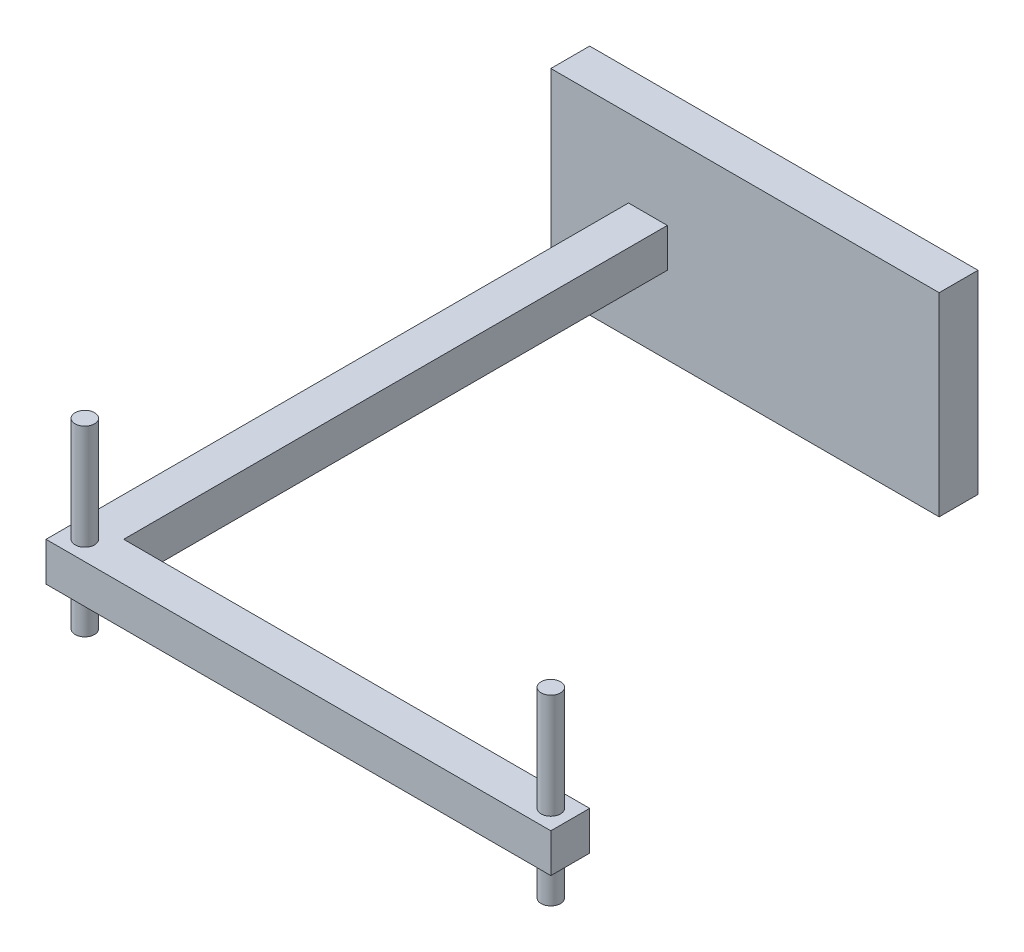
ISO-10303-21;
HEADER;
FILE_DESCRIPTION(('STEP AP214'),'2;1');
FILE_NAME('part.step','',(''),(''),'','','');
FILE_SCHEMA(('AUTOMOTIVE_DESIGN { 1 0 10303 214 1 1 1 1 }'));
ENDSEC;
DATA;
#1=APPLICATION_CONTEXT('core data for automotive mechanical design processes');
#2=APPLICATION_PROTOCOL_DEFINITION('international standard','automotive_design',2000,#1);
#3=PRODUCT_CONTEXT('',#1,'mechanical');
#4=PRODUCT('Part','Part','',(#3));
#5=PRODUCT_RELATED_PRODUCT_CATEGORY('part','',(#4));
#6=PRODUCT_DEFINITION_FORMATION('','',#4);
#7=PRODUCT_DEFINITION_CONTEXT('part definition',#1,'design');
#8=PRODUCT_DEFINITION('design','',#6,#7);
#9=PRODUCT_DEFINITION_SHAPE('','',#8);
#10=(LENGTH_UNIT() NAMED_UNIT(*) SI_UNIT(.MILLI.,.METRE.));
#11=(NAMED_UNIT(*) PLANE_ANGLE_UNIT() SI_UNIT($,.RADIAN.));
#12=(NAMED_UNIT(*) SI_UNIT($,.STERADIAN.) SOLID_ANGLE_UNIT());
#13=UNCERTAINTY_MEASURE_WITH_UNIT(LENGTH_MEASURE(1.E-05),#10,'distance_accuracy_value','');
#14=(GEOMETRIC_REPRESENTATION_CONTEXT(3) GLOBAL_UNCERTAINTY_ASSIGNED_CONTEXT((#13)) GLOBAL_UNIT_ASSIGNED_CONTEXT((#10,
#11,#12)) REPRESENTATION_CONTEXT('',''));
#15=CARTESIAN_POINT('',(0.,0.,0.));
#16=DIRECTION('',(0.,0.,1.));
#17=DIRECTION('',(1.,0.,0.));
#18=AXIS2_PLACEMENT_3D('',#15,#16,#17);
#19=CARTESIAN_POINT('',(-20.,5.,160.));
#20=DIRECTION('',(-1.,0.,0.));
#21=DIRECTION('',(0.,-1.,0.));
#22=AXIS2_PLACEMENT_3D('',#19,#20,#21);
#23=PLANE('',#22);
#24=DIRECTION('',(0.,1.,0.));
#25=VECTOR('',#24,1.);
#26=CARTESIAN_POINT('',(-20.,5.,150.));
#27=LINE('',#26,#25);
#28=CARTESIAN_POINT('',(-20.,-5.,150.));
#29=VERTEX_POINT('',#28);
#30=CARTESIAN_POINT('',(-20.,5.,150.));
#31=VERTEX_POINT('',#30);
#32=EDGE_CURVE('E146',#29,#31,#27,.T.);
#33=ORIENTED_EDGE('',*,*,#32,.F.);
#34=DIRECTION('',(0.,0.,-1.));
#35=VECTOR('',#34,1.);
#36=CARTESIAN_POINT('',(-20.,-5.,160.));
#37=LINE('',#36,#35);
#38=CARTESIAN_POINT('',(-20.,-5.,10.));
#39=VERTEX_POINT('',#38);
#40=EDGE_CURVE('E173',#29,#39,#37,.T.);
#41=ORIENTED_EDGE('',*,*,#40,.T.);
#42=DIRECTION('',(0.,1.,0.));
#43=VECTOR('',#42,1.);
#44=CARTESIAN_POINT('',(-20.,5.,10.));
#45=LINE('',#44,#43);
#46=CARTESIAN_POINT('',(-20.,5.,10.));
#47=VERTEX_POINT('',#46);
#48=EDGE_CURVE('E167',#39,#47,#45,.T.);
#49=ORIENTED_EDGE('',*,*,#48,.T.);
#50=DIRECTION('',(0.,0.,-1.));
#51=VECTOR('',#50,1.);
#52=CARTESIAN_POINT('',(-20.,5.,160.));
#53=LINE('',#52,#51);
#54=EDGE_CURVE('E48',#31,#47,#53,.T.);
#55=ORIENTED_EDGE('',*,*,#54,.F.);
#56=EDGE_LOOP('',(#33,#41,#49,#55));
#57=FACE_BOUND('',#56,.T.);
#58=ADVANCED_FACE('F33',(#57),#23,.F.);
#59=CARTESIAN_POINT('',(0.,0.,10.));
#60=DIRECTION('',(0.,0.,1.));
#61=DIRECTION('',(1.,0.,0.));
#62=AXIS2_PLACEMENT_3D('',#59,#60,#61);
#63=PLANE('',#62);
#64=DIRECTION('',(0.,1.,0.));
#65=VECTOR('',#64,1.);
#66=CARTESIAN_POINT('',(50.,25.,10.));
#67=LINE('',#66,#65);
#68=CARTESIAN_POINT('',(50.,-25.,10.));
#69=VERTEX_POINT('',#68);
#70=CARTESIAN_POINT('',(50.,25.,10.));
#71=VERTEX_POINT('',#70);
#72=EDGE_CURVE('E178',#69,#71,#67,.T.);
#73=ORIENTED_EDGE('',*,*,#72,.T.);
#74=DIRECTION('',(-1.,0.,0.));
#75=VECTOR('',#74,1.);
#76=CARTESIAN_POINT('',(-50.,25.,10.));
#77=LINE('',#76,#75);
#78=CARTESIAN_POINT('',(-50.,25.,10.));
#79=VERTEX_POINT('',#78);
#80=EDGE_CURVE('E86',#71,#79,#77,.T.);
#81=ORIENTED_EDGE('',*,*,#80,.T.);
#82=DIRECTION('',(0.,-1.,0.));
#83=VECTOR('',#82,1.);
#84=CARTESIAN_POINT('',(-50.,25.,10.));
#85=LINE('',#84,#83);
#86=CARTESIAN_POINT('',(-50.,-25.,10.));
#87=VERTEX_POINT('',#86);
#88=EDGE_CURVE('E181',#79,#87,#85,.T.);
#89=ORIENTED_EDGE('',*,*,#88,.T.);
#90=DIRECTION('',(1.,0.,0.));
#91=VECTOR('',#90,1.);
#92=CARTESIAN_POINT('',(-50.,-25.,10.));
#93=LINE('',#92,#91);
#94=EDGE_CURVE('E57',#87,#69,#93,.T.);
#95=ORIENTED_EDGE('',*,*,#94,.T.);
#96=EDGE_LOOP('',(#73,#81,#89,#95));
#97=FACE_BOUND('',#96,.T.);
#98=DIRECTION('',(1.,0.,0.));
#99=VECTOR('',#98,1.);
#100=CARTESIAN_POINT('',(-20.,-5.,10.));
#101=LINE('',#100,#99);
#102=CARTESIAN_POINT('',(-30.,-5.,10.));
#103=VERTEX_POINT('',#102);
#104=EDGE_CURVE('E165',#103,#39,#101,.T.);
#105=ORIENTED_EDGE('',*,*,#104,.F.);
#106=DIRECTION('',(0.,-1.,0.));
#107=VECTOR('',#106,1.);
#108=CARTESIAN_POINT('',(-30.,5.,10.));
#109=LINE('',#108,#107);
#110=CARTESIAN_POINT('',(-30.,5.,10.));
#111=VERTEX_POINT('',#110);
#112=EDGE_CURVE('E158',#111,#103,#109,.T.);
#113=ORIENTED_EDGE('',*,*,#112,.F.);
#114=DIRECTION('',(-1.,0.,0.));
#115=VECTOR('',#114,1.);
#116=CARTESIAN_POINT('',(-20.,5.,10.));
#117=LINE('',#116,#115);
#118=EDGE_CURVE('E159',#47,#111,#117,.T.);
#119=ORIENTED_EDGE('',*,*,#118,.F.);
#120=ORIENTED_EDGE('',*,*,#48,.F.);
#121=EDGE_LOOP('',(#105,#113,#119,#120));
#122=FACE_BOUND('',#121,.T.);
#123=ADVANCED_FACE('F221',(#97,#122),#63,.T.);
#124=CARTESIAN_POINT('',(50.,25.,10.));
#125=DIRECTION('',(-1.,0.,0.));
#126=DIRECTION('',(0.,-1.,0.));
#127=AXIS2_PLACEMENT_3D('',#124,#125,#126);
#128=PLANE('',#127);
#129=DIRECTION('',(0.,1.,0.));
#130=VECTOR('',#129,1.);
#131=CARTESIAN_POINT('',(50.,25.,0.));
#132=LINE('',#131,#130);
#133=CARTESIAN_POINT('',(50.,-25.,0.));
#134=VERTEX_POINT('',#133);
#135=CARTESIAN_POINT('',(50.,25.,0.));
#136=VERTEX_POINT('',#135);
#137=EDGE_CURVE('E177',#134,#136,#132,.T.);
#138=ORIENTED_EDGE('',*,*,#137,.T.);
#139=DIRECTION('',(0.,0.,-1.));
#140=VECTOR('',#139,1.);
#141=CARTESIAN_POINT('',(50.,25.,10.));
#142=LINE('',#141,#140);
#143=EDGE_CURVE('E198',#71,#136,#142,.T.);
#144=ORIENTED_EDGE('',*,*,#143,.F.);
#145=ORIENTED_EDGE('',*,*,#72,.F.);
#146=DIRECTION('',(0.,0.,-1.));
#147=VECTOR('',#146,1.);
#148=CARTESIAN_POINT('',(50.,-25.,10.));
#149=LINE('',#148,#147);
#150=EDGE_CURVE('E184',#69,#134,#149,.T.);
#151=ORIENTED_EDGE('',*,*,#150,.T.);
#152=EDGE_LOOP('',(#138,#144,#145,#151));
#153=FACE_BOUND('',#152,.T.);
#154=ADVANCED_FACE('F35',(#153),#128,.F.);
#155=CARTESIAN_POINT('',(-50.,25.,10.));
#156=DIRECTION('',(0.,-1.,0.));
#157=DIRECTION('',(0.,0.,-1.));
#158=AXIS2_PLACEMENT_3D('',#155,#156,#157);
#159=PLANE('',#158);
#160=DIRECTION('',(-1.,0.,0.));
#161=VECTOR('',#160,1.);
#162=CARTESIAN_POINT('',(-50.,25.,0.));
#163=LINE('',#162,#161);
#164=CARTESIAN_POINT('',(-50.,25.,0.));
#165=VERTEX_POINT('',#164);
#166=EDGE_CURVE('E187',#136,#165,#163,.T.);
#167=ORIENTED_EDGE('',*,*,#166,.T.);
#168=DIRECTION('',(0.,0.,-1.));
#169=VECTOR('',#168,1.);
#170=CARTESIAN_POINT('',(-50.,25.,10.));
#171=LINE('',#170,#169);
#172=EDGE_CURVE('E195',#79,#165,#171,.T.);
#173=ORIENTED_EDGE('',*,*,#172,.F.);
#174=ORIENTED_EDGE('',*,*,#80,.F.);
#175=ORIENTED_EDGE('',*,*,#143,.T.);
#176=EDGE_LOOP('',(#167,#173,#174,#175));
#177=FACE_BOUND('',#176,.T.);
#178=ADVANCED_FACE('F422',(#177),#159,.F.);
#179=CARTESIAN_POINT('',(-50.,25.,10.));
#180=DIRECTION('',(1.,0.,0.));
#181=DIRECTION('',(0.,1.,0.));
#182=AXIS2_PLACEMENT_3D('',#179,#180,#181);
#183=PLANE('',#182);
#184=DIRECTION('',(0.,-1.,0.));
#185=VECTOR('',#184,1.);
#186=CARTESIAN_POINT('',(-50.,25.,0.));
#187=LINE('',#186,#185);
#188=CARTESIAN_POINT('',(-50.,-25.,0.));
#189=VERTEX_POINT('',#188);
#190=EDGE_CURVE('E189',#165,#189,#187,.T.);
#191=ORIENTED_EDGE('',*,*,#190,.T.);
#192=DIRECTION('',(0.,0.,-1.));
#193=VECTOR('',#192,1.);
#194=CARTESIAN_POINT('',(-50.,-25.,10.));
#195=LINE('',#194,#193);
#196=EDGE_CURVE('E193',#87,#189,#195,.T.);
#197=ORIENTED_EDGE('',*,*,#196,.F.);
#198=ORIENTED_EDGE('',*,*,#88,.F.);
#199=ORIENTED_EDGE('',*,*,#172,.T.);
#200=EDGE_LOOP('',(#191,#197,#198,#199));
#201=FACE_BOUND('',#200,.T.);
#202=ADVANCED_FACE('F413',(#201),#183,.F.);
#203=CARTESIAN_POINT('',(-50.,-25.,10.));
#204=DIRECTION('',(0.,1.,0.));
#205=DIRECTION('',(0.,0.,1.));
#206=AXIS2_PLACEMENT_3D('',#203,#204,#205);
#207=PLANE('',#206);
#208=DIRECTION('',(1.,0.,0.));
#209=VECTOR('',#208,1.);
#210=CARTESIAN_POINT('',(-50.,-25.,0.));
#211=LINE('',#210,#209);
#212=EDGE_CURVE('E78',#189,#134,#211,.T.);
#213=ORIENTED_EDGE('',*,*,#212,.T.);
#214=ORIENTED_EDGE('',*,*,#150,.F.);
#215=ORIENTED_EDGE('',*,*,#94,.F.);
#216=ORIENTED_EDGE('',*,*,#196,.T.);
#217=EDGE_LOOP('',(#213,#214,#215,#216));
#218=FACE_BOUND('',#217,.T.);
#219=ADVANCED_FACE('F403',(#218),#207,.F.);
#220=CARTESIAN_POINT('',(0.,0.,0.));
#221=DIRECTION('',(0.,0.,1.));
#222=DIRECTION('',(1.,0.,0.));
#223=AXIS2_PLACEMENT_3D('',#220,#221,#222);
#224=PLANE('',#223);
#225=ORIENTED_EDGE('',*,*,#137,.F.);
#226=ORIENTED_EDGE('',*,*,#212,.F.);
#227=ORIENTED_EDGE('',*,*,#190,.F.);
#228=ORIENTED_EDGE('',*,*,#166,.F.);
#229=EDGE_LOOP('',(#225,#226,#227,#228));
#230=FACE_BOUND('',#229,.T.);
#231=ADVANCED_FACE('F215',(#230),#224,.F.);
#232=CARTESIAN_POINT('',(-30.,5.,160.));
#233=DIRECTION('',(1.,0.,0.));
#234=DIRECTION('',(0.,0.,-1.));
#235=AXIS2_PLACEMENT_3D('',#232,#233,#234);
#236=PLANE('',#235);
#237=ORIENTED_EDGE('',*,*,#112,.T.);
#238=DIRECTION('',(0.,0.,-1.));
#239=VECTOR('',#238,1.);
#240=CARTESIAN_POINT('',(-30.,-5.,160.));
#241=LINE('',#240,#239);
#242=CARTESIAN_POINT('',(-30.,-5.,160.));
#243=VERTEX_POINT('',#242);
#244=EDGE_CURVE('E175',#243,#103,#241,.T.);
#245=ORIENTED_EDGE('',*,*,#244,.F.);
#246=DIRECTION('',(0.,-1.,0.));
#247=VECTOR('',#246,1.);
#248=CARTESIAN_POINT('',(-30.,5.,160.));
#249=LINE('',#248,#247);
#250=CARTESIAN_POINT('',(-30.,5.,160.));
#251=VERTEX_POINT('',#250);
#252=EDGE_CURVE('E127',#251,#243,#249,.T.);
#253=ORIENTED_EDGE('',*,*,#252,.F.);
#254=DIRECTION('',(0.,0.,-1.));
#255=VECTOR('',#254,1.);
#256=CARTESIAN_POINT('',(-30.,5.,160.));
#257=LINE('',#256,#255);
#258=EDGE_CURVE('E162',#251,#111,#257,.T.);
#259=ORIENTED_EDGE('',*,*,#258,.T.);
#260=EDGE_LOOP('',(#237,#245,#253,#259));
#261=FACE_BOUND('',#260,.T.);
#262=ADVANCED_FACE('F206',(#261),#236,.F.);
#263=CARTESIAN_POINT('',(-20.,-5.,160.));
#264=DIRECTION('',(0.,1.,0.));
#265=DIRECTION('',(-1.,0.,0.));
#266=AXIS2_PLACEMENT_3D('',#263,#264,#265);
#267=PLANE('',#266);
#268=CARTESIAN_POINT('',(95.,-4.99999999999999,155.));
#269=DIRECTION('',(0.,1.,0.));
#270=DIRECTION('',(-1.,0.,0.));
#271=AXIS2_PLACEMENT_3D('',#268,#269,#270);
#272=CIRCLE('',#271,2.50000000000001);
#273=CARTESIAN_POINT('',(92.5,-4.99999999999999,155.));
#274=VERTEX_POINT('',#273);
#275=EDGE_CURVE('E11',#274,#274,#272,.F.);
#276=ORIENTED_EDGE('',*,*,#275,.F.);
#277=EDGE_LOOP('',(#276));
#278=FACE_BOUND('',#277,.T.);
#279=CARTESIAN_POINT('',(-25.,-5.,155.));
#280=DIRECTION('',(0.,1.,0.));
#281=DIRECTION('',(-1.,0.,0.));
#282=AXIS2_PLACEMENT_3D('',#279,#280,#281);
#283=CIRCLE('',#282,2.5);
#284=CARTESIAN_POINT('',(-27.5,-5.,155.));
#285=VERTEX_POINT('',#284);
#286=EDGE_CURVE('E41',#285,#285,#283,.F.);
#287=ORIENTED_EDGE('',*,*,#286,.F.);
#288=EDGE_LOOP('',(#287));
#289=FACE_BOUND('',#288,.T.);
#290=ORIENTED_EDGE('',*,*,#104,.T.);
#291=ORIENTED_EDGE('',*,*,#40,.F.);
#292=DIRECTION('',(-1.,0.,0.));
#293=VECTOR('',#292,1.);
#294=CARTESIAN_POINT('',(100.,-4.99999999999998,150.));
#295=LINE('',#294,#293);
#296=CARTESIAN_POINT('',(100.,-4.99999999999998,150.));
#297=VERTEX_POINT('',#296);
#298=EDGE_CURVE('E137',#297,#29,#295,.T.);
#299=ORIENTED_EDGE('',*,*,#298,.F.);
#300=DIRECTION('',(0.,0.,-1.));
#301=VECTOR('',#300,1.);
#302=CARTESIAN_POINT('',(100.,-4.99999999999998,150.));
#303=LINE('',#302,#301);
#304=CARTESIAN_POINT('',(100.,-4.99999999999998,160.));
#305=VERTEX_POINT('',#304);
#306=EDGE_CURVE('E133',#305,#297,#303,.T.);
#307=ORIENTED_EDGE('',*,*,#306,.F.);
#308=DIRECTION('',(1.,0.,0.));
#309=VECTOR('',#308,1.);
#310=CARTESIAN_POINT('',(-20.,-5.,160.));
#311=LINE('',#310,#309);
#312=EDGE_CURVE('E121',#243,#305,#311,.T.);
#313=ORIENTED_EDGE('',*,*,#312,.F.);
#314=ORIENTED_EDGE('',*,*,#244,.T.);
#315=EDGE_LOOP('',(#290,#291,#299,#307,#313,#314));
#316=FACE_BOUND('',#315,.T.);
#317=ADVANCED_FACE('F135',(#278,#289,#316),#267,.F.);
#318=CARTESIAN_POINT('',(-20.,5.,160.));
#319=DIRECTION('',(0.,-1.,0.));
#320=DIRECTION('',(0.,0.,-1.));
#321=AXIS2_PLACEMENT_3D('',#318,#319,#320);
#322=PLANE('',#321);
#323=CARTESIAN_POINT('',(-25.,5.,155.));
#324=DIRECTION('',(0.,-1.,0.));
#325=DIRECTION('',(0.,0.,-1.));
#326=AXIS2_PLACEMENT_3D('',#323,#324,#325);
#327=CIRCLE('',#326,2.50000000000001);
#328=CARTESIAN_POINT('',(-25.,5.,152.5));
#329=VERTEX_POINT('',#328);
#330=EDGE_CURVE('E273',#329,#329,#327,.T.);
#331=ORIENTED_EDGE('',*,*,#330,.T.);
#332=EDGE_LOOP('',(#331));
#333=FACE_BOUND('',#332,.T.);
#334=CARTESIAN_POINT('',(95.,5.,155.));
#335=DIRECTION('',(0.,-1.,0.));
#336=DIRECTION('',(0.,0.,-1.));
#337=AXIS2_PLACEMENT_3D('',#334,#335,#336);
#338=CIRCLE('',#337,2.50000000000001);
#339=CARTESIAN_POINT('',(95.,5.,152.5));
#340=VERTEX_POINT('',#339);
#341=EDGE_CURVE('E272',#340,#340,#338,.T.);
#342=ORIENTED_EDGE('',*,*,#341,.T.);
#343=EDGE_LOOP('',(#342));
#344=FACE_BOUND('',#343,.T.);
#345=ORIENTED_EDGE('',*,*,#118,.T.);
#346=ORIENTED_EDGE('',*,*,#258,.F.);
#347=DIRECTION('',(-1.,0.,0.));
#348=VECTOR('',#347,1.);
#349=CARTESIAN_POINT('',(-20.,5.,160.));
#350=LINE('',#349,#348);
#351=CARTESIAN_POINT('',(100.,5.00000000000002,160.));
#352=VERTEX_POINT('',#351);
#353=EDGE_CURVE('E130',#352,#251,#350,.T.);
#354=ORIENTED_EDGE('',*,*,#353,.F.);
#355=DIRECTION('',(0.,0.,1.));
#356=VECTOR('',#355,1.);
#357=CARTESIAN_POINT('',(100.,5.00000000000002,150.));
#358=LINE('',#357,#356);
#359=CARTESIAN_POINT('',(100.,5.00000000000002,150.));
#360=VERTEX_POINT('',#359);
#361=EDGE_CURVE('E145',#360,#352,#358,.T.);
#362=ORIENTED_EDGE('',*,*,#361,.F.);
#363=DIRECTION('',(-1.,0.,0.));
#364=VECTOR('',#363,1.);
#365=CARTESIAN_POINT('',(100.,5.00000000000002,150.));
#366=LINE('',#365,#364);
#367=EDGE_CURVE('E154',#360,#31,#366,.T.);
#368=ORIENTED_EDGE('',*,*,#367,.T.);
#369=ORIENTED_EDGE('',*,*,#54,.T.);
#370=EDGE_LOOP('',(#345,#346,#354,#362,#368,#369));
#371=FACE_BOUND('',#370,.T.);
#372=ADVANCED_FACE('F205',(#333,#344,#371),#322,.F.);
#373=CARTESIAN_POINT('',(0.,0.,160.));
#374=DIRECTION('',(0.,0.,-1.));
#375=DIRECTION('',(-1.,0.,0.));
#376=AXIS2_PLACEMENT_3D('',#373,#374,#375);
#377=PLANE('',#376);
#378=ORIENTED_EDGE('',*,*,#252,.T.);
#379=ORIENTED_EDGE('',*,*,#312,.T.);
#380=DIRECTION('',(0.,-1.,0.));
#381=VECTOR('',#380,1.);
#382=CARTESIAN_POINT('',(100.,5.00000000000002,160.));
#383=LINE('',#382,#381);
#384=EDGE_CURVE('E125',#352,#305,#383,.T.);
#385=ORIENTED_EDGE('',*,*,#384,.F.);
#386=ORIENTED_EDGE('',*,*,#353,.T.);
#387=EDGE_LOOP('',(#378,#379,#385,#386));
#388=FACE_BOUND('',#387,.T.);
#389=ADVANCED_FACE('F123',(#388),#377,.F.);
#390=CARTESIAN_POINT('',(100.,5.00000000000002,150.));
#391=DIRECTION('',(0.,0.,1.));
#392=DIRECTION('',(1.,0.,0.));
#393=AXIS2_PLACEMENT_3D('',#390,#391,#392);
#394=PLANE('',#393);
#395=ORIENTED_EDGE('',*,*,#32,.T.);
#396=ORIENTED_EDGE('',*,*,#367,.F.);
#397=DIRECTION('',(0.,1.,0.));
#398=VECTOR('',#397,1.);
#399=CARTESIAN_POINT('',(100.,5.00000000000002,150.));
#400=LINE('',#399,#398);
#401=EDGE_CURVE('E140',#297,#360,#400,.T.);
#402=ORIENTED_EDGE('',*,*,#401,.F.);
#403=ORIENTED_EDGE('',*,*,#298,.T.);
#404=EDGE_LOOP('',(#395,#396,#402,#403));
#405=FACE_BOUND('',#404,.T.);
#406=ADVANCED_FACE('F231',(#405),#394,.F.);
#407=CARTESIAN_POINT('',(100.,0.,0.));
#408=DIRECTION('',(-1.,0.,0.));
#409=DIRECTION('',(0.,0.,1.));
#410=AXIS2_PLACEMENT_3D('',#407,#408,#409);
#411=PLANE('',#410);
#412=ORIENTED_EDGE('',*,*,#384,.T.);
#413=ORIENTED_EDGE('',*,*,#306,.T.);
#414=ORIENTED_EDGE('',*,*,#401,.T.);
#415=ORIENTED_EDGE('',*,*,#361,.T.);
#416=EDGE_LOOP('',(#412,#413,#414,#415));
#417=FACE_BOUND('',#416,.T.);
#418=ADVANCED_FACE('F143',(#417),#411,.F.);
#419=CARTESIAN_POINT('',(-25.,-15.,155.));
#420=DIRECTION('',(0.,1.,0.));
#421=DIRECTION('',(-1.,0.,0.));
#422=AXIS2_PLACEMENT_3D('',#419,#420,#421);
#423=CYLINDRICAL_SURFACE('',#422,2.5);
#424=CARTESIAN_POINT('',(-25.,-15.,155.));
#425=DIRECTION('',(0.,-1.,0.));
#426=DIRECTION('',(1.,0.,0.));
#427=AXIS2_PLACEMENT_3D('',#424,#425,#426);
#428=CIRCLE('',#427,2.5);
#429=CARTESIAN_POINT('',(-22.5,-15.,155.));
#430=VERTEX_POINT('',#429);
#431=EDGE_CURVE('E148',#430,#430,#428,.T.);
#432=ORIENTED_EDGE('',*,*,#431,.F.);
#433=EDGE_LOOP('',(#432));
#434=FACE_BOUND('',#433,.T.);
#435=ORIENTED_EDGE('',*,*,#286,.T.);
#436=EDGE_LOOP('',(#435));
#437=FACE_BOUND('',#436,.T.);
#438=ADVANCED_FACE('F202',(#434,#437),#423,.T.);
#439=CARTESIAN_POINT('',(-25.,-15.,155.));
#440=DIRECTION('',(0.,-1.,0.));
#441=DIRECTION('',(1.,0.,0.));
#442=AXIS2_PLACEMENT_3D('',#439,#440,#441);
#443=PLANE('',#442);
#444=ORIENTED_EDGE('',*,*,#431,.T.);
#445=EDGE_LOOP('',(#444));
#446=FACE_BOUND('',#445,.T.);
#447=ADVANCED_FACE('F239',(#446),#443,.T.);
#448=CARTESIAN_POINT('',(95.,-15.,155.));
#449=DIRECTION('',(0.,1.,0.));
#450=DIRECTION('',(-1.,0.,0.));
#451=AXIS2_PLACEMENT_3D('',#448,#449,#450);
#452=CYLINDRICAL_SURFACE('',#451,2.50000000000001);
#453=CARTESIAN_POINT('',(95.,-15.,155.));
#454=DIRECTION('',(0.,-1.,0.));
#455=DIRECTION('',(1.,0.,0.));
#456=AXIS2_PLACEMENT_3D('',#453,#454,#455);
#457=CIRCLE('',#456,2.50000000000001);
#458=CARTESIAN_POINT('',(97.5,-15.,155.));
#459=VERTEX_POINT('',#458);
#460=EDGE_CURVE('E282',#459,#459,#457,.T.);
#461=ORIENTED_EDGE('',*,*,#460,.F.);
#462=EDGE_LOOP('',(#461));
#463=FACE_BOUND('',#462,.T.);
#464=ORIENTED_EDGE('',*,*,#275,.T.);
#465=EDGE_LOOP('',(#464));
#466=FACE_BOUND('',#465,.T.);
#467=ADVANCED_FACE('F243',(#463,#466),#452,.T.);
#468=CARTESIAN_POINT('',(95.,-15.,155.));
#469=DIRECTION('',(0.,-1.,0.));
#470=DIRECTION('',(1.,0.,0.));
#471=AXIS2_PLACEMENT_3D('',#468,#469,#470);
#472=PLANE('',#471);
#473=ORIENTED_EDGE('',*,*,#460,.T.);
#474=EDGE_LOOP('',(#473));
#475=FACE_BOUND('',#474,.T.);
#476=ADVANCED_FACE('F247',(#475),#472,.T.);
#477=CARTESIAN_POINT('',(95.,32.,155.));
#478=DIRECTION('',(0.,-1.,0.));
#479=DIRECTION('',(0.,0.,-1.));
#480=AXIS2_PLACEMENT_3D('',#477,#478,#479);
#481=CYLINDRICAL_SURFACE('',#480,2.50000000000001);
#482=CARTESIAN_POINT('',(95.,32.,155.));
#483=DIRECTION('',(0.,-1.,0.));
#484=DIRECTION('',(0.,0.,-1.));
#485=AXIS2_PLACEMENT_3D('',#482,#483,#484);
#486=CIRCLE('',#485,2.50000000000001);
#487=CARTESIAN_POINT('',(95.,32.,152.5));
#488=VERTEX_POINT('',#487);
#489=EDGE_CURVE('E276',#488,#488,#486,.T.);
#490=ORIENTED_EDGE('',*,*,#489,.T.);
#491=EDGE_LOOP('',(#490));
#492=FACE_BOUND('',#491,.T.);
#493=ORIENTED_EDGE('',*,*,#341,.F.);
#494=EDGE_LOOP('',(#493));
#495=FACE_BOUND('',#494,.T.);
#496=ADVANCED_FACE('F251',(#492,#495),#481,.T.);
#497=CARTESIAN_POINT('',(95.,32.,155.));
#498=DIRECTION('',(0.,-1.,0.));
#499=DIRECTION('',(0.,0.,-1.));
#500=AXIS2_PLACEMENT_3D('',#497,#498,#499);
#501=PLANE('',#500);
#502=ORIENTED_EDGE('',*,*,#489,.F.);
#503=EDGE_LOOP('',(#502));
#504=FACE_BOUND('',#503,.T.);
#505=ADVANCED_FACE('F255',(#504),#501,.F.);
#506=CARTESIAN_POINT('',(-25.,32.,155.));
#507=DIRECTION('',(0.,-1.,0.));
#508=DIRECTION('',(0.,0.,-1.));
#509=AXIS2_PLACEMENT_3D('',#506,#507,#508);
#510=CYLINDRICAL_SURFACE('',#509,2.50000000000001);
#511=CARTESIAN_POINT('',(-25.,32.,155.));
#512=DIRECTION('',(0.,-1.,0.));
#513=DIRECTION('',(0.,0.,-1.));
#514=AXIS2_PLACEMENT_3D('',#511,#512,#513);
#515=CIRCLE('',#514,2.50000000000001);
#516=CARTESIAN_POINT('',(-25.,32.,152.5));
#517=VERTEX_POINT('',#516);
#518=EDGE_CURVE('E271',#517,#517,#515,.T.);
#519=ORIENTED_EDGE('',*,*,#518,.T.);
#520=EDGE_LOOP('',(#519));
#521=FACE_BOUND('',#520,.T.);
#522=ORIENTED_EDGE('',*,*,#330,.F.);
#523=EDGE_LOOP('',(#522));
#524=FACE_BOUND('',#523,.T.);
#525=ADVANCED_FACE('F259',(#521,#524),#510,.T.);
#526=CARTESIAN_POINT('',(-25.,32.,155.));
#527=DIRECTION('',(0.,-1.,0.));
#528=DIRECTION('',(0.,0.,-1.));
#529=AXIS2_PLACEMENT_3D('',#526,#527,#528);
#530=PLANE('',#529);
#531=ORIENTED_EDGE('',*,*,#518,.F.);
#532=EDGE_LOOP('',(#531));
#533=FACE_BOUND('',#532,.T.);
#534=ADVANCED_FACE('F263',(#533),#530,.F.);
#535=CLOSED_SHELL('',(#58,#123,#154,#178,#202,#219,#231,#262,#317,#372,#389,#406,#418,#438,#447,
#467,#476,#496,#505,#525,#534));
#536=MANIFOLD_SOLID_BREP('B2',#535);
#537=ADVANCED_BREP_SHAPE_REPRESENTATION('',(#18,#536),#14);
#538=SHAPE_DEFINITION_REPRESENTATION(#9,#537);
ENDSEC;
END-ISO-10303-21;
